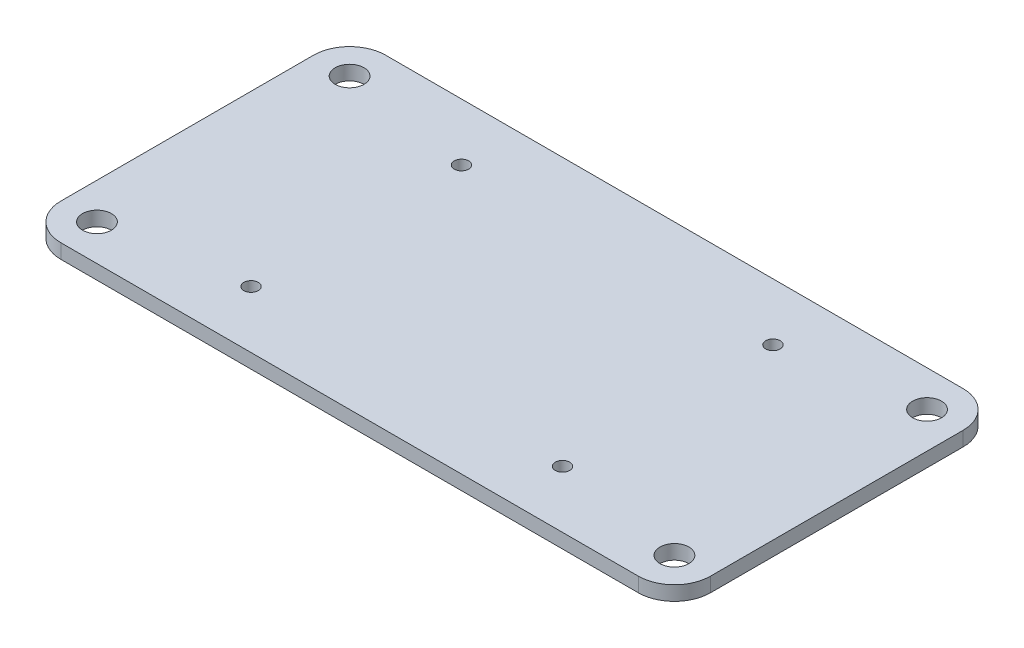
ISO-10303-21;
HEADER;
FILE_DESCRIPTION(('STEP AP214'),'2;1');
FILE_NAME('part.step','',(''),(''),'','','');
FILE_SCHEMA(('AUTOMOTIVE_DESIGN { 1 0 10303 214 1 1 1 1 }'));
ENDSEC;
DATA;
#1=APPLICATION_CONTEXT('core data for automotive mechanical design processes');
#2=APPLICATION_PROTOCOL_DEFINITION('international standard','automotive_design',2000,#1);
#3=PRODUCT_CONTEXT('',#1,'mechanical');
#4=PRODUCT('Part','Part','',(#3));
#5=PRODUCT_RELATED_PRODUCT_CATEGORY('part','',(#4));
#6=PRODUCT_DEFINITION_FORMATION('','',#4);
#7=PRODUCT_DEFINITION_CONTEXT('part definition',#1,'design');
#8=PRODUCT_DEFINITION('design','',#6,#7);
#9=PRODUCT_DEFINITION_SHAPE('','',#8);
#10=(LENGTH_UNIT() NAMED_UNIT(*) SI_UNIT(.MILLI.,.METRE.));
#11=(NAMED_UNIT(*) PLANE_ANGLE_UNIT() SI_UNIT($,.RADIAN.));
#12=(NAMED_UNIT(*) SI_UNIT($,.STERADIAN.) SOLID_ANGLE_UNIT());
#13=UNCERTAINTY_MEASURE_WITH_UNIT(LENGTH_MEASURE(1.E-05),#10,'distance_accuracy_value','');
#14=(GEOMETRIC_REPRESENTATION_CONTEXT(3) GLOBAL_UNCERTAINTY_ASSIGNED_CONTEXT((#13)) GLOBAL_UNIT_ASSIGNED_CONTEXT((#10,
#11,#12)) REPRESENTATION_CONTEXT('',''));
#15=CARTESIAN_POINT('',(0.,0.,0.));
#16=DIRECTION('',(0.,0.,1.));
#17=DIRECTION('',(1.,0.,0.));
#18=AXIS2_PLACEMENT_3D('',#15,#16,#17);
#19=CARTESIAN_POINT('',(90.,4.,45.));
#20=DIRECTION('',(-1.,0.,0.));
#21=DIRECTION('',(0.,0.,1.));
#22=AXIS2_PLACEMENT_3D('',#19,#20,#21);
#23=PLANE('',#22);
#24=DIRECTION('',(0.,0.,-1.));
#25=VECTOR('',#24,1.);
#26=CARTESIAN_POINT('',(90.,4.,45.));
#27=LINE('',#26,#25);
#28=CARTESIAN_POINT('',(90.,4.,35.));
#29=VERTEX_POINT('',#28);
#30=CARTESIAN_POINT('',(90.,4.,-35.));
#31=VERTEX_POINT('',#30);
#32=EDGE_CURVE('E123',#29,#31,#27,.T.);
#33=ORIENTED_EDGE('',*,*,#32,.F.);
#34=DIRECTION('',(0.,-1.,0.));
#35=VECTOR('',#34,1.);
#36=CARTESIAN_POINT('',(90.,4.,35.));
#37=LINE('',#36,#35);
#38=CARTESIAN_POINT('',(90.,0.,35.));
#39=VERTEX_POINT('',#38);
#40=EDGE_CURVE('E108',#29,#39,#37,.T.);
#41=ORIENTED_EDGE('',*,*,#40,.T.);
#42=DIRECTION('',(0.,0.,-1.));
#43=VECTOR('',#42,1.);
#44=CARTESIAN_POINT('',(90.,0.,45.));
#45=LINE('',#44,#43);
#46=CARTESIAN_POINT('',(90.,0.,-35.));
#47=VERTEX_POINT('',#46);
#48=EDGE_CURVE('E120',#39,#47,#45,.T.);
#49=ORIENTED_EDGE('',*,*,#48,.T.);
#50=DIRECTION('',(0.,-1.,0.));
#51=VECTOR('',#50,1.);
#52=CARTESIAN_POINT('',(90.,4.,-35.));
#53=LINE('',#52,#51);
#54=EDGE_CURVE('E125',#47,#31,#53,.F.);
#55=ORIENTED_EDGE('',*,*,#54,.T.);
#56=EDGE_LOOP('',(#33,#41,#49,#55));
#57=FACE_BOUND('',#56,.T.);
#58=ADVANCED_FACE('F38',(#57),#23,.F.);
#59=CARTESIAN_POINT('',(-90.,4.,-45.));
#60=DIRECTION('',(0.,0.,1.));
#61=DIRECTION('',(1.,0.,0.));
#62=AXIS2_PLACEMENT_3D('',#59,#60,#61);
#63=PLANE('',#62);
#64=DIRECTION('',(-1.,0.,0.));
#65=VECTOR('',#64,1.);
#66=CARTESIAN_POINT('',(-90.,4.,-45.));
#67=LINE('',#66,#65);
#68=CARTESIAN_POINT('',(79.9999999999999,4.,-45.));
#69=VERTEX_POINT('',#68);
#70=CARTESIAN_POINT('',(-80.,4.,-45.));
#71=VERTEX_POINT('',#70);
#72=EDGE_CURVE('E169',#69,#71,#67,.T.);
#73=ORIENTED_EDGE('',*,*,#72,.F.);
#74=DIRECTION('',(0.,-1.,0.));
#75=VECTOR('',#74,1.);
#76=CARTESIAN_POINT('',(80.,4.,-45.));
#77=LINE('',#76,#75);
#78=CARTESIAN_POINT('',(79.9999999999999,0.,-45.));
#79=VERTEX_POINT('',#78);
#80=EDGE_CURVE('E162',#69,#79,#77,.T.);
#81=ORIENTED_EDGE('',*,*,#80,.T.);
#82=DIRECTION('',(-1.,0.,0.));
#83=VECTOR('',#82,1.);
#84=CARTESIAN_POINT('',(-90.,0.,-45.));
#85=LINE('',#84,#83);
#86=CARTESIAN_POINT('',(-80.,0.,-45.));
#87=VERTEX_POINT('',#86);
#88=EDGE_CURVE('E129',#79,#87,#85,.T.);
#89=ORIENTED_EDGE('',*,*,#88,.T.);
#90=DIRECTION('',(0.,-1.,0.));
#91=VECTOR('',#90,1.);
#92=CARTESIAN_POINT('',(-80.,4.,-45.));
#93=LINE('',#92,#91);
#94=EDGE_CURVE('E160',#87,#71,#93,.F.);
#95=ORIENTED_EDGE('',*,*,#94,.T.);
#96=EDGE_LOOP('',(#73,#81,#89,#95));
#97=FACE_BOUND('',#96,.T.);
#98=ADVANCED_FACE('F167',(#97),#63,.F.);
#99=CARTESIAN_POINT('',(-90.,4.,45.));
#100=DIRECTION('',(1.,0.,0.));
#101=DIRECTION('',(0.,0.,-1.));
#102=AXIS2_PLACEMENT_3D('',#99,#100,#101);
#103=PLANE('',#102);
#104=DIRECTION('',(0.,0.,1.));
#105=VECTOR('',#104,1.);
#106=CARTESIAN_POINT('',(-90.,4.,45.));
#107=LINE('',#106,#105);
#108=CARTESIAN_POINT('',(-90.,4.,-35.));
#109=VERTEX_POINT('',#108);
#110=CARTESIAN_POINT('',(-90.,4.,35.));
#111=VERTEX_POINT('',#110);
#112=EDGE_CURVE('E177',#109,#111,#107,.T.);
#113=ORIENTED_EDGE('',*,*,#112,.F.);
#114=DIRECTION('',(0.,-1.,0.));
#115=VECTOR('',#114,1.);
#116=CARTESIAN_POINT('',(-90.,4.,-35.));
#117=LINE('',#116,#115);
#118=CARTESIAN_POINT('',(-90.,0.,-35.));
#119=VERTEX_POINT('',#118);
#120=EDGE_CURVE('E11',#109,#119,#117,.T.);
#121=ORIENTED_EDGE('',*,*,#120,.T.);
#122=DIRECTION('',(0.,0.,1.));
#123=VECTOR('',#122,1.);
#124=CARTESIAN_POINT('',(-90.,0.,45.));
#125=LINE('',#124,#123);
#126=CARTESIAN_POINT('',(-90.,0.,35.));
#127=VERTEX_POINT('',#126);
#128=EDGE_CURVE('E133',#119,#127,#125,.T.);
#129=ORIENTED_EDGE('',*,*,#128,.T.);
#130=DIRECTION('',(0.,-1.,0.));
#131=VECTOR('',#130,1.);
#132=CARTESIAN_POINT('',(-90.,4.,35.));
#133=LINE('',#132,#131);
#134=EDGE_CURVE('E46',#127,#111,#133,.F.);
#135=ORIENTED_EDGE('',*,*,#134,.T.);
#136=EDGE_LOOP('',(#113,#121,#129,#135));
#137=FACE_BOUND('',#136,.T.);
#138=ADVANCED_FACE('F176',(#137),#103,.F.);
#139=CARTESIAN_POINT('',(-90.,4.,45.));
#140=DIRECTION('',(0.,0.,-1.));
#141=DIRECTION('',(-1.,0.,0.));
#142=AXIS2_PLACEMENT_3D('',#139,#140,#141);
#143=PLANE('',#142);
#144=DIRECTION('',(1.,0.,0.));
#145=VECTOR('',#144,1.);
#146=CARTESIAN_POINT('',(-90.,0.,45.));
#147=LINE('',#146,#145);
#148=CARTESIAN_POINT('',(-80.,0.,45.));
#149=VERTEX_POINT('',#148);
#150=CARTESIAN_POINT('',(79.9999999999999,0.,45.));
#151=VERTEX_POINT('',#150);
#152=EDGE_CURVE('E143',#149,#151,#147,.T.);
#153=ORIENTED_EDGE('',*,*,#152,.T.);
#154=DIRECTION('',(0.,-1.,0.));
#155=VECTOR('',#154,1.);
#156=CARTESIAN_POINT('',(80.,4.,45.));
#157=LINE('',#156,#155);
#158=CARTESIAN_POINT('',(79.9999999999999,4.,45.));
#159=VERTEX_POINT('',#158);
#160=EDGE_CURVE('E109',#151,#159,#157,.F.);
#161=ORIENTED_EDGE('',*,*,#160,.T.);
#162=DIRECTION('',(1.,0.,0.));
#163=VECTOR('',#162,1.);
#164=CARTESIAN_POINT('',(-90.,4.,45.));
#165=LINE('',#164,#163);
#166=CARTESIAN_POINT('',(-80.,4.,45.));
#167=VERTEX_POINT('',#166);
#168=EDGE_CURVE('E139',#167,#159,#165,.T.);
#169=ORIENTED_EDGE('',*,*,#168,.F.);
#170=DIRECTION('',(0.,-1.,0.));
#171=VECTOR('',#170,1.);
#172=CARTESIAN_POINT('',(-80.,4.,45.));
#173=LINE('',#172,#171);
#174=EDGE_CURVE('E114',#167,#149,#173,.T.);
#175=ORIENTED_EDGE('',*,*,#174,.T.);
#176=EDGE_LOOP('',(#153,#161,#169,#175));
#177=FACE_BOUND('',#176,.T.);
#178=ADVANCED_FACE('F233',(#177),#143,.F.);
#179=CARTESIAN_POINT('',(0.,4.,0.));
#180=DIRECTION('',(0.,-1.,0.));
#181=DIRECTION('',(0.,0.,-1.));
#182=AXIS2_PLACEMENT_3D('',#179,#180,#181);
#183=PLANE('',#182);
#184=CARTESIAN_POINT('',(43.15,4.,-29.15));
#185=DIRECTION('',(0.,1.,0.));
#186=DIRECTION('',(0.,0.,-1.));
#187=AXIS2_PLACEMENT_3D('',#184,#185,#186);
#188=CIRCLE('',#187,2.);
#189=CARTESIAN_POINT('',(43.15,4.,-31.15));
#190=VERTEX_POINT('',#189);
#191=EDGE_CURVE('E213',#190,#190,#188,.T.);
#192=ORIENTED_EDGE('',*,*,#191,.F.);
#193=EDGE_LOOP('',(#192));
#194=FACE_BOUND('',#193,.T.);
#195=CARTESIAN_POINT('',(43.1499999999999,4.,29.1499999999999));
#196=DIRECTION('',(0.,1.,0.));
#197=DIRECTION('',(0.,0.,-1.));
#198=AXIS2_PLACEMENT_3D('',#195,#196,#197);
#199=CIRCLE('',#198,2.);
#200=CARTESIAN_POINT('',(43.1499999999999,4.,27.1499999999999));
#201=VERTEX_POINT('',#200);
#202=EDGE_CURVE('E219',#201,#201,#199,.T.);
#203=ORIENTED_EDGE('',*,*,#202,.F.);
#204=EDGE_LOOP('',(#203));
#205=FACE_BOUND('',#204,.T.);
#206=CARTESIAN_POINT('',(-43.15,4.,29.15));
#207=DIRECTION('',(0.,1.,0.));
#208=DIRECTION('',(0.,0.,1.));
#209=AXIS2_PLACEMENT_3D('',#206,#207,#208);
#210=CIRCLE('',#209,2.);
#211=CARTESIAN_POINT('',(-43.15,4.,31.15));
#212=VERTEX_POINT('',#211);
#213=EDGE_CURVE('E207',#212,#212,#210,.T.);
#214=ORIENTED_EDGE('',*,*,#213,.F.);
#215=EDGE_LOOP('',(#214));
#216=FACE_BOUND('',#215,.T.);
#217=CARTESIAN_POINT('',(-43.15,4.,-29.15));
#218=DIRECTION('',(0.,1.,0.));
#219=DIRECTION('',(0.,0.,1.));
#220=AXIS2_PLACEMENT_3D('',#217,#218,#219);
#221=CIRCLE('',#220,2.);
#222=CARTESIAN_POINT('',(-43.15,4.,-27.15));
#223=VERTEX_POINT('',#222);
#224=EDGE_CURVE('E190',#223,#223,#221,.T.);
#225=ORIENTED_EDGE('',*,*,#224,.F.);
#226=EDGE_LOOP('',(#225));
#227=FACE_BOUND('',#226,.T.);
#228=CARTESIAN_POINT('',(80.,4.,-35.));
#229=DIRECTION('',(0.,1.,0.));
#230=DIRECTION('',(0.,0.,-1.));
#231=AXIS2_PLACEMENT_3D('',#228,#229,#230);
#232=CIRCLE('',#231,4.00000000000001);
#233=CARTESIAN_POINT('',(80.,4.,-39.));
#234=VERTEX_POINT('',#233);
#235=EDGE_CURVE('E189',#234,#234,#232,.T.);
#236=ORIENTED_EDGE('',*,*,#235,.F.);
#237=EDGE_LOOP('',(#236));
#238=FACE_BOUND('',#237,.T.);
#239=CARTESIAN_POINT('',(80.,4.,35.));
#240=DIRECTION('',(0.,1.,0.));
#241=DIRECTION('',(0.,0.,-1.));
#242=AXIS2_PLACEMENT_3D('',#239,#240,#241);
#243=CIRCLE('',#242,4.00000000000001);
#244=CARTESIAN_POINT('',(80.,4.,31.));
#245=VERTEX_POINT('',#244);
#246=EDGE_CURVE('E196',#245,#245,#243,.T.);
#247=ORIENTED_EDGE('',*,*,#246,.F.);
#248=EDGE_LOOP('',(#247));
#249=FACE_BOUND('',#248,.T.);
#250=CARTESIAN_POINT('',(-80.,4.,35.));
#251=DIRECTION('',(0.,1.,0.));
#252=DIRECTION('',(0.,0.,1.));
#253=AXIS2_PLACEMENT_3D('',#250,#251,#252);
#254=CIRCLE('',#253,4.00000000000001);
#255=CARTESIAN_POINT('',(-80.,4.,39.));
#256=VERTEX_POINT('',#255);
#257=EDGE_CURVE('E184',#256,#256,#254,.T.);
#258=ORIENTED_EDGE('',*,*,#257,.F.);
#259=EDGE_LOOP('',(#258));
#260=FACE_BOUND('',#259,.T.);
#261=CARTESIAN_POINT('',(-80.,4.,-35.));
#262=DIRECTION('',(0.,1.,0.));
#263=DIRECTION('',(0.,0.,1.));
#264=AXIS2_PLACEMENT_3D('',#261,#262,#263);
#265=CIRCLE('',#264,4.00000000000001);
#266=CARTESIAN_POINT('',(-80.,4.,-31.));
#267=VERTEX_POINT('',#266);
#268=EDGE_CURVE('E130',#267,#267,#265,.T.);
#269=ORIENTED_EDGE('',*,*,#268,.F.);
#270=EDGE_LOOP('',(#269));
#271=FACE_BOUND('',#270,.T.);
#272=ORIENTED_EDGE('',*,*,#168,.T.);
#273=CARTESIAN_POINT('',(80.,4.,35.));
#274=DIRECTION('',(0.,-1.,0.));
#275=DIRECTION('',(0.,0.,-1.));
#276=AXIS2_PLACEMENT_3D('',#273,#274,#275);
#277=CIRCLE('',#276,10.);
#278=EDGE_CURVE('E158',#159,#29,#277,.F.);
#279=ORIENTED_EDGE('',*,*,#278,.T.);
#280=ORIENTED_EDGE('',*,*,#32,.T.);
#281=CARTESIAN_POINT('',(80.,4.,-35.));
#282=DIRECTION('',(0.,-1.,0.));
#283=DIRECTION('',(0.,0.,-1.));
#284=AXIS2_PLACEMENT_3D('',#281,#282,#283);
#285=CIRCLE('',#284,10.);
#286=EDGE_CURVE('E156',#31,#69,#285,.F.);
#287=ORIENTED_EDGE('',*,*,#286,.T.);
#288=ORIENTED_EDGE('',*,*,#72,.T.);
#289=CARTESIAN_POINT('',(-80.,4.,-35.));
#290=DIRECTION('',(0.,-1.,0.));
#291=DIRECTION('',(0.,0.,-1.));
#292=AXIS2_PLACEMENT_3D('',#289,#290,#291);
#293=CIRCLE('',#292,10.);
#294=EDGE_CURVE('E59',#71,#109,#293,.F.);
#295=ORIENTED_EDGE('',*,*,#294,.T.);
#296=ORIENTED_EDGE('',*,*,#112,.T.);
#297=CARTESIAN_POINT('',(-80.,4.,35.));
#298=DIRECTION('',(0.,-1.,0.));
#299=DIRECTION('',(0.,0.,-1.));
#300=AXIS2_PLACEMENT_3D('',#297,#298,#299);
#301=CIRCLE('',#300,10.);
#302=EDGE_CURVE('E153',#111,#167,#301,.F.);
#303=ORIENTED_EDGE('',*,*,#302,.T.);
#304=EDGE_LOOP('',(#272,#279,#280,#287,#288,#295,#296,#303));
#305=FACE_BOUND('',#304,.T.);
#306=ADVANCED_FACE('F230',(#194,#205,#216,#227,#238,#249,#260,#271,#305),#183,.F.);
#307=CARTESIAN_POINT('',(0.,0.,0.));
#308=DIRECTION('',(0.,-1.,0.));
#309=DIRECTION('',(0.,0.,-1.));
#310=AXIS2_PLACEMENT_3D('',#307,#308,#309);
#311=PLANE('',#310);
#312=CARTESIAN_POINT('',(43.15,0.,-29.15));
#313=DIRECTION('',(0.,-1.,0.));
#314=DIRECTION('',(0.,0.,-1.));
#315=AXIS2_PLACEMENT_3D('',#312,#313,#314);
#316=CIRCLE('',#315,2.);
#317=CARTESIAN_POINT('',(43.15,0.,-31.15));
#318=VERTEX_POINT('',#317);
#319=EDGE_CURVE('E210',#318,#318,#316,.F.);
#320=ORIENTED_EDGE('',*,*,#319,.T.);
#321=EDGE_LOOP('',(#320));
#322=FACE_BOUND('',#321,.T.);
#323=CARTESIAN_POINT('',(43.1499999999999,0.,29.1499999999999));
#324=DIRECTION('',(0.,-1.,0.));
#325=DIRECTION('',(0.,0.,-1.));
#326=AXIS2_PLACEMENT_3D('',#323,#324,#325);
#327=CIRCLE('',#326,2.);
#328=CARTESIAN_POINT('',(43.1499999999999,0.,27.1499999999999));
#329=VERTEX_POINT('',#328);
#330=EDGE_CURVE('E216',#329,#329,#327,.F.);
#331=ORIENTED_EDGE('',*,*,#330,.T.);
#332=EDGE_LOOP('',(#331));
#333=FACE_BOUND('',#332,.T.);
#334=CARTESIAN_POINT('',(-43.15,0.,29.15));
#335=DIRECTION('',(0.,-1.,0.));
#336=DIRECTION('',(0.,0.,-1.));
#337=AXIS2_PLACEMENT_3D('',#334,#335,#336);
#338=CIRCLE('',#337,2.);
#339=CARTESIAN_POINT('',(-43.15,0.,27.15));
#340=VERTEX_POINT('',#339);
#341=EDGE_CURVE('E222',#340,#340,#338,.F.);
#342=ORIENTED_EDGE('',*,*,#341,.T.);
#343=EDGE_LOOP('',(#342));
#344=FACE_BOUND('',#343,.T.);
#345=CARTESIAN_POINT('',(-43.15,0.,-29.15));
#346=DIRECTION('',(0.,-1.,0.));
#347=DIRECTION('',(0.,0.,-1.));
#348=AXIS2_PLACEMENT_3D('',#345,#346,#347);
#349=CIRCLE('',#348,2.);
#350=CARTESIAN_POINT('',(-43.15,0.,-31.15));
#351=VERTEX_POINT('',#350);
#352=EDGE_CURVE('E204',#351,#351,#349,.F.);
#353=ORIENTED_EDGE('',*,*,#352,.T.);
#354=EDGE_LOOP('',(#353));
#355=FACE_BOUND('',#354,.T.);
#356=CARTESIAN_POINT('',(80.,0.,-35.));
#357=DIRECTION('',(0.,-1.,0.));
#358=DIRECTION('',(0.,0.,-1.));
#359=AXIS2_PLACEMENT_3D('',#356,#357,#358);
#360=CIRCLE('',#359,4.00000000000001);
#361=CARTESIAN_POINT('',(80.,0.,-39.));
#362=VERTEX_POINT('',#361);
#363=EDGE_CURVE('E186',#362,#362,#360,.F.);
#364=ORIENTED_EDGE('',*,*,#363,.T.);
#365=EDGE_LOOP('',(#364));
#366=FACE_BOUND('',#365,.T.);
#367=CARTESIAN_POINT('',(80.,0.,35.));
#368=DIRECTION('',(0.,-1.,0.));
#369=DIRECTION('',(0.,0.,-1.));
#370=AXIS2_PLACEMENT_3D('',#367,#368,#369);
#371=CIRCLE('',#370,4.00000000000001);
#372=CARTESIAN_POINT('',(80.,0.,31.));
#373=VERTEX_POINT('',#372);
#374=EDGE_CURVE('E193',#373,#373,#371,.F.);
#375=ORIENTED_EDGE('',*,*,#374,.T.);
#376=EDGE_LOOP('',(#375));
#377=FACE_BOUND('',#376,.T.);
#378=CARTESIAN_POINT('',(-80.,0.,35.));
#379=DIRECTION('',(0.,-1.,0.));
#380=DIRECTION('',(0.,0.,-1.));
#381=AXIS2_PLACEMENT_3D('',#378,#379,#380);
#382=CIRCLE('',#381,4.00000000000001);
#383=CARTESIAN_POINT('',(-80.,0.,31.));
#384=VERTEX_POINT('',#383);
#385=EDGE_CURVE('E199',#384,#384,#382,.F.);
#386=ORIENTED_EDGE('',*,*,#385,.T.);
#387=EDGE_LOOP('',(#386));
#388=FACE_BOUND('',#387,.T.);
#389=CARTESIAN_POINT('',(-80.,0.,-35.));
#390=DIRECTION('',(0.,-1.,0.));
#391=DIRECTION('',(0.,0.,-1.));
#392=AXIS2_PLACEMENT_3D('',#389,#390,#391);
#393=CIRCLE('',#392,4.00000000000001);
#394=CARTESIAN_POINT('',(-80.,0.,-39.));
#395=VERTEX_POINT('',#394);
#396=EDGE_CURVE('E136',#395,#395,#393,.F.);
#397=ORIENTED_EDGE('',*,*,#396,.T.);
#398=EDGE_LOOP('',(#397));
#399=FACE_BOUND('',#398,.T.);
#400=ORIENTED_EDGE('',*,*,#48,.F.);
#401=CARTESIAN_POINT('',(80.,0.,35.));
#402=DIRECTION('',(0.,-1.,0.));
#403=DIRECTION('',(0.,0.,-1.));
#404=AXIS2_PLACEMENT_3D('',#401,#402,#403);
#405=CIRCLE('',#404,10.);
#406=EDGE_CURVE('E104',#39,#151,#405,.T.);
#407=ORIENTED_EDGE('',*,*,#406,.T.);
#408=ORIENTED_EDGE('',*,*,#152,.F.);
#409=CARTESIAN_POINT('',(-80.,0.,35.));
#410=DIRECTION('',(0.,-1.,0.));
#411=DIRECTION('',(0.,0.,-1.));
#412=AXIS2_PLACEMENT_3D('',#409,#410,#411);
#413=CIRCLE('',#412,10.);
#414=EDGE_CURVE('E124',#149,#127,#413,.T.);
#415=ORIENTED_EDGE('',*,*,#414,.T.);
#416=ORIENTED_EDGE('',*,*,#128,.F.);
#417=CARTESIAN_POINT('',(-80.,0.,-35.));
#418=DIRECTION('',(0.,-1.,0.));
#419=DIRECTION('',(0.,0.,-1.));
#420=AXIS2_PLACEMENT_3D('',#417,#418,#419);
#421=CIRCLE('',#420,10.);
#422=EDGE_CURVE('E147',#119,#87,#421,.T.);
#423=ORIENTED_EDGE('',*,*,#422,.T.);
#424=ORIENTED_EDGE('',*,*,#88,.F.);
#425=CARTESIAN_POINT('',(80.,0.,-35.));
#426=DIRECTION('',(0.,-1.,0.));
#427=DIRECTION('',(0.,0.,-1.));
#428=AXIS2_PLACEMENT_3D('',#425,#426,#427);
#429=CIRCLE('',#428,10.);
#430=EDGE_CURVE('E115',#79,#47,#429,.T.);
#431=ORIENTED_EDGE('',*,*,#430,.T.);
#432=EDGE_LOOP('',(#400,#407,#408,#415,#416,#423,#424,#431));
#433=FACE_BOUND('',#432,.T.);
#434=ADVANCED_FACE('F127',(#322,#333,#344,#355,#366,#377,#388,#399,#433),#311,.T.);
#435=CARTESIAN_POINT('',(80.,4.,35.));
#436=DIRECTION('',(0.,-1.,0.));
#437=DIRECTION('',(0.,0.,-1.));
#438=AXIS2_PLACEMENT_3D('',#435,#436,#437);
#439=CYLINDRICAL_SURFACE('',#438,10.);
#440=ORIENTED_EDGE('',*,*,#278,.F.);
#441=ORIENTED_EDGE('',*,*,#160,.F.);
#442=ORIENTED_EDGE('',*,*,#406,.F.);
#443=ORIENTED_EDGE('',*,*,#40,.F.);
#444=EDGE_LOOP('',(#440,#441,#442,#443));
#445=FACE_BOUND('',#444,.T.);
#446=ADVANCED_FACE('F107',(#445),#439,.T.);
#447=CARTESIAN_POINT('',(80.,4.,-35.));
#448=DIRECTION('',(0.,-1.,0.));
#449=DIRECTION('',(0.,0.,-1.));
#450=AXIS2_PLACEMENT_3D('',#447,#448,#449);
#451=CYLINDRICAL_SURFACE('',#450,10.);
#452=ORIENTED_EDGE('',*,*,#286,.F.);
#453=ORIENTED_EDGE('',*,*,#54,.F.);
#454=ORIENTED_EDGE('',*,*,#430,.F.);
#455=ORIENTED_EDGE('',*,*,#80,.F.);
#456=EDGE_LOOP('',(#452,#453,#454,#455));
#457=FACE_BOUND('',#456,.T.);
#458=ADVANCED_FACE('F258',(#457),#451,.T.);
#459=CARTESIAN_POINT('',(-80.,4.,-35.));
#460=DIRECTION('',(0.,-1.,0.));
#461=DIRECTION('',(0.,0.,-1.));
#462=AXIS2_PLACEMENT_3D('',#459,#460,#461);
#463=CYLINDRICAL_SURFACE('',#462,10.);
#464=ORIENTED_EDGE('',*,*,#294,.F.);
#465=ORIENTED_EDGE('',*,*,#94,.F.);
#466=ORIENTED_EDGE('',*,*,#422,.F.);
#467=ORIENTED_EDGE('',*,*,#120,.F.);
#468=EDGE_LOOP('',(#464,#465,#466,#467));
#469=FACE_BOUND('',#468,.T.);
#470=ADVANCED_FACE('F175',(#469),#463,.T.);
#471=CARTESIAN_POINT('',(-80.,4.,35.));
#472=DIRECTION('',(0.,-1.,0.));
#473=DIRECTION('',(0.,0.,-1.));
#474=AXIS2_PLACEMENT_3D('',#471,#472,#473);
#475=CYLINDRICAL_SURFACE('',#474,10.);
#476=ORIENTED_EDGE('',*,*,#302,.F.);
#477=ORIENTED_EDGE('',*,*,#134,.F.);
#478=ORIENTED_EDGE('',*,*,#414,.F.);
#479=ORIENTED_EDGE('',*,*,#174,.F.);
#480=EDGE_LOOP('',(#476,#477,#478,#479));
#481=FACE_BOUND('',#480,.T.);
#482=ADVANCED_FACE('F40',(#481),#475,.T.);
#483=CARTESIAN_POINT('',(-80.,-0.00100000000000013,-35.));
#484=DIRECTION('',(0.,1.,0.));
#485=DIRECTION('',(0.,0.,1.));
#486=AXIS2_PLACEMENT_3D('',#483,#484,#485);
#487=CYLINDRICAL_SURFACE('',#486,4.00000000000001);
#488=ORIENTED_EDGE('',*,*,#396,.F.);
#489=EDGE_LOOP('',(#488));
#490=FACE_BOUND('',#489,.T.);
#491=ORIENTED_EDGE('',*,*,#268,.T.);
#492=EDGE_LOOP('',(#491));
#493=FACE_BOUND('',#492,.T.);
#494=ADVANCED_FACE('F250',(#490,#493),#487,.F.);
#495=CARTESIAN_POINT('',(-80.,-0.00100000000000013,35.));
#496=DIRECTION('',(0.,1.,0.));
#497=DIRECTION('',(0.,0.,1.));
#498=AXIS2_PLACEMENT_3D('',#495,#496,#497);
#499=CYLINDRICAL_SURFACE('',#498,4.00000000000001);
#500=ORIENTED_EDGE('',*,*,#385,.F.);
#501=EDGE_LOOP('',(#500));
#502=FACE_BOUND('',#501,.T.);
#503=ORIENTED_EDGE('',*,*,#257,.T.);
#504=EDGE_LOOP('',(#503));
#505=FACE_BOUND('',#504,.T.);
#506=ADVANCED_FACE('F255',(#502,#505),#499,.F.);
#507=CARTESIAN_POINT('',(80.,-0.00100000000000013,35.));
#508=DIRECTION('',(0.,1.,0.));
#509=DIRECTION('',(0.,0.,1.));
#510=AXIS2_PLACEMENT_3D('',#507,#508,#509);
#511=CYLINDRICAL_SURFACE('',#510,4.00000000000001);
#512=ORIENTED_EDGE('',*,*,#374,.F.);
#513=EDGE_LOOP('',(#512));
#514=FACE_BOUND('',#513,.T.);
#515=ORIENTED_EDGE('',*,*,#246,.T.);
#516=EDGE_LOOP('',(#515));
#517=FACE_BOUND('',#516,.T.);
#518=ADVANCED_FACE('F298',(#514,#517),#511,.F.);
#519=CARTESIAN_POINT('',(80.,-0.00100000000000013,-35.));
#520=DIRECTION('',(0.,1.,0.));
#521=DIRECTION('',(0.,0.,1.));
#522=AXIS2_PLACEMENT_3D('',#519,#520,#521);
#523=CYLINDRICAL_SURFACE('',#522,4.00000000000001);
#524=ORIENTED_EDGE('',*,*,#363,.F.);
#525=EDGE_LOOP('',(#524));
#526=FACE_BOUND('',#525,.T.);
#527=ORIENTED_EDGE('',*,*,#235,.T.);
#528=EDGE_LOOP('',(#527));
#529=FACE_BOUND('',#528,.T.);
#530=ADVANCED_FACE('F308',(#526,#529),#523,.F.);
#531=CARTESIAN_POINT('',(-43.15,-0.00100000000000013,-29.15));
#532=DIRECTION('',(0.,1.,0.));
#533=DIRECTION('',(0.,0.,1.));
#534=AXIS2_PLACEMENT_3D('',#531,#532,#533);
#535=CYLINDRICAL_SURFACE('',#534,2.);
#536=ORIENTED_EDGE('',*,*,#352,.F.);
#537=EDGE_LOOP('',(#536));
#538=FACE_BOUND('',#537,.T.);
#539=ORIENTED_EDGE('',*,*,#224,.T.);
#540=EDGE_LOOP('',(#539));
#541=FACE_BOUND('',#540,.T.);
#542=ADVANCED_FACE('F318',(#538,#541),#535,.F.);
#543=CARTESIAN_POINT('',(-43.15,-0.00100000000000013,29.15));
#544=DIRECTION('',(0.,1.,0.));
#545=DIRECTION('',(0.,0.,1.));
#546=AXIS2_PLACEMENT_3D('',#543,#544,#545);
#547=CYLINDRICAL_SURFACE('',#546,2.);
#548=ORIENTED_EDGE('',*,*,#341,.F.);
#549=EDGE_LOOP('',(#548));
#550=FACE_BOUND('',#549,.T.);
#551=ORIENTED_EDGE('',*,*,#213,.T.);
#552=EDGE_LOOP('',(#551));
#553=FACE_BOUND('',#552,.T.);
#554=ADVANCED_FACE('F228',(#550,#553),#547,.F.);
#555=CARTESIAN_POINT('',(43.1499999999999,-0.00100000000000013,29.1499999999999));
#556=DIRECTION('',(0.,1.,0.));
#557=DIRECTION('',(0.,0.,1.));
#558=AXIS2_PLACEMENT_3D('',#555,#556,#557);
#559=CYLINDRICAL_SURFACE('',#558,2.);
#560=ORIENTED_EDGE('',*,*,#330,.F.);
#561=EDGE_LOOP('',(#560));
#562=FACE_BOUND('',#561,.T.);
#563=ORIENTED_EDGE('',*,*,#202,.T.);
#564=EDGE_LOOP('',(#563));
#565=FACE_BOUND('',#564,.T.);
#566=ADVANCED_FACE('F354',(#562,#565),#559,.F.);
#567=CARTESIAN_POINT('',(43.15,-0.00100000000000013,-29.15));
#568=DIRECTION('',(0.,1.,0.));
#569=DIRECTION('',(0.,0.,1.));
#570=AXIS2_PLACEMENT_3D('',#567,#568,#569);
#571=CYLINDRICAL_SURFACE('',#570,2.);
#572=ORIENTED_EDGE('',*,*,#319,.F.);
#573=EDGE_LOOP('',(#572));
#574=FACE_BOUND('',#573,.T.);
#575=ORIENTED_EDGE('',*,*,#191,.T.);
#576=EDGE_LOOP('',(#575));
#577=FACE_BOUND('',#576,.T.);
#578=ADVANCED_FACE('F364',(#574,#577),#571,.F.);
#579=CLOSED_SHELL('',(#58,#98,#138,#178,#306,#434,#446,#458,#470,#482,#494,#506,#518,#530,#542,
#554,#566,#578));
#580=MANIFOLD_SOLID_BREP('B2',#579);
#581=ADVANCED_BREP_SHAPE_REPRESENTATION('',(#18,#580),#14);
#582=SHAPE_DEFINITION_REPRESENTATION(#9,#581);
ENDSEC;
END-ISO-10303-21;
